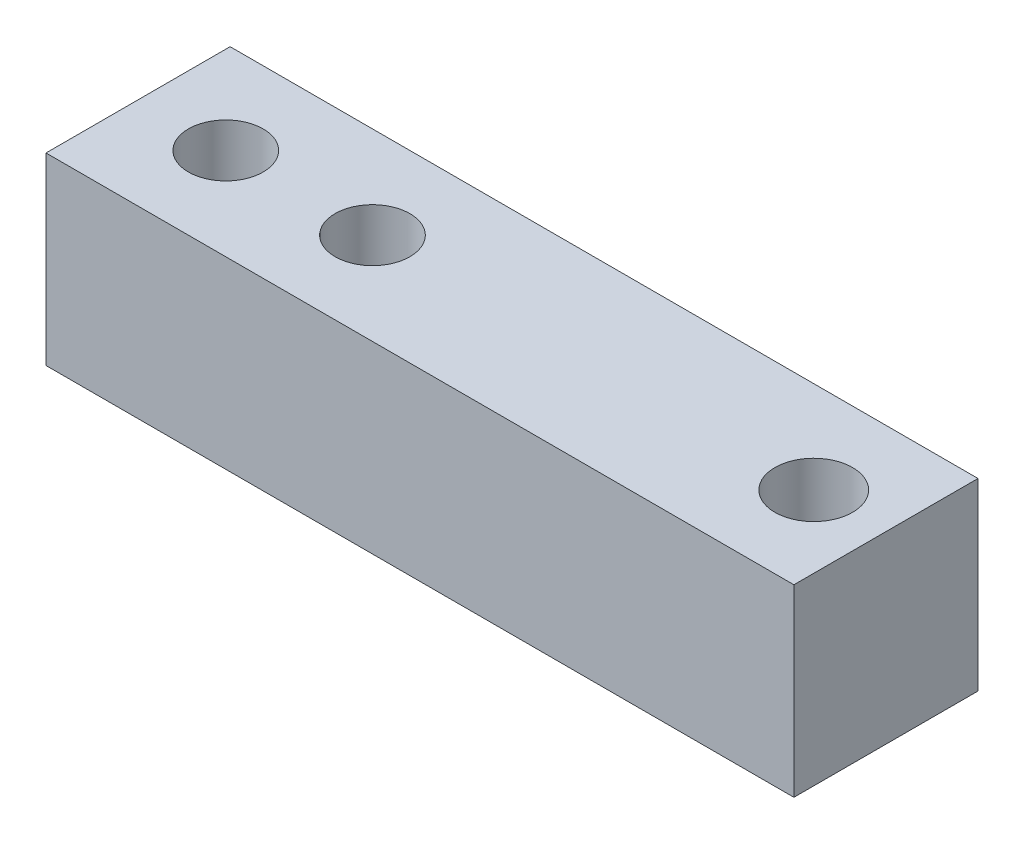
ISO-10303-21;
HEADER;
FILE_DESCRIPTION(('STEP AP214'),'2;1');
FILE_NAME('part.step','',(''),(''),'','','');
FILE_SCHEMA(('AUTOMOTIVE_DESIGN { 1 0 10303 214 1 1 1 1 }'));
ENDSEC;
DATA;
#1=APPLICATION_CONTEXT('core data for automotive mechanical design processes');
#2=APPLICATION_PROTOCOL_DEFINITION('international standard','automotive_design',2000,#1);
#3=PRODUCT_CONTEXT('',#1,'mechanical');
#4=PRODUCT('Part','Part','',(#3));
#5=PRODUCT_RELATED_PRODUCT_CATEGORY('part','',(#4));
#6=PRODUCT_DEFINITION_FORMATION('','',#4);
#7=PRODUCT_DEFINITION_CONTEXT('part definition',#1,'design');
#8=PRODUCT_DEFINITION('design','',#6,#7);
#9=PRODUCT_DEFINITION_SHAPE('','',#8);
#10=(LENGTH_UNIT() NAMED_UNIT(*) SI_UNIT(.MILLI.,.METRE.));
#11=(NAMED_UNIT(*) PLANE_ANGLE_UNIT() SI_UNIT($,.RADIAN.));
#12=(NAMED_UNIT(*) SI_UNIT($,.STERADIAN.) SOLID_ANGLE_UNIT());
#13=UNCERTAINTY_MEASURE_WITH_UNIT(LENGTH_MEASURE(1.E-05),#10,'distance_accuracy_value','');
#14=(GEOMETRIC_REPRESENTATION_CONTEXT(3) GLOBAL_UNCERTAINTY_ASSIGNED_CONTEXT((#13)) GLOBAL_UNIT_ASSIGNED_CONTEXT((#10,
#11,#12)) REPRESENTATION_CONTEXT('',''));
#15=CARTESIAN_POINT('',(0.,0.,0.));
#16=DIRECTION('',(0.,0.,1.));
#17=DIRECTION('',(1.,0.,0.));
#18=AXIS2_PLACEMENT_3D('',#15,#16,#17);
#19=CARTESIAN_POINT('',(65.,32.,-16.));
#20=DIRECTION('',(-1.,0.,0.));
#21=DIRECTION('',(0.,0.,1.));
#22=AXIS2_PLACEMENT_3D('',#19,#20,#21);
#23=PLANE('',#22);
#24=DIRECTION('',(0.,0.,-1.));
#25=VECTOR('',#24,1.);
#26=CARTESIAN_POINT('',(65.,0.,-16.));
#27=LINE('',#26,#25);
#28=CARTESIAN_POINT('',(65.,0.,16.));
#29=VERTEX_POINT('',#28);
#30=CARTESIAN_POINT('',(65.,0.,-16.));
#31=VERTEX_POINT('',#30);
#32=EDGE_CURVE('E107',#29,#31,#27,.T.);
#33=ORIENTED_EDGE('',*,*,#32,.T.);
#34=DIRECTION('',(0.,-1.,0.));
#35=VECTOR('',#34,1.);
#36=CARTESIAN_POINT('',(65.,32.,-16.));
#37=LINE('',#36,#35);
#38=CARTESIAN_POINT('',(65.,32.,-16.));
#39=VERTEX_POINT('',#38);
#40=EDGE_CURVE('E11',#39,#31,#37,.T.);
#41=ORIENTED_EDGE('',*,*,#40,.F.);
#42=DIRECTION('',(0.,0.,-1.));
#43=VECTOR('',#42,1.);
#44=CARTESIAN_POINT('',(65.,32.,-16.));
#45=LINE('',#44,#43);
#46=CARTESIAN_POINT('',(65.,32.,16.));
#47=VERTEX_POINT('',#46);
#48=EDGE_CURVE('E91',#47,#39,#45,.T.);
#49=ORIENTED_EDGE('',*,*,#48,.F.);
#50=DIRECTION('',(0.,-1.,0.));
#51=VECTOR('',#50,1.);
#52=CARTESIAN_POINT('',(65.,32.,16.));
#53=LINE('',#52,#51);
#54=EDGE_CURVE('E103',#47,#29,#53,.T.);
#55=ORIENTED_EDGE('',*,*,#54,.T.);
#56=EDGE_LOOP('',(#33,#41,#49,#55));
#57=FACE_BOUND('',#56,.T.);
#58=ADVANCED_FACE('F39',(#57),#23,.F.);
#59=CARTESIAN_POINT('',(-65.,32.,-16.));
#60=DIRECTION('',(0.,0.,1.));
#61=DIRECTION('',(1.,0.,0.));
#62=AXIS2_PLACEMENT_3D('',#59,#60,#61);
#63=PLANE('',#62);
#64=DIRECTION('',(-1.,0.,0.));
#65=VECTOR('',#64,1.);
#66=CARTESIAN_POINT('',(-65.,0.,-16.));
#67=LINE('',#66,#65);
#68=CARTESIAN_POINT('',(-65.,0.,-16.));
#69=VERTEX_POINT('',#68);
#70=EDGE_CURVE('E96',#31,#69,#67,.T.);
#71=ORIENTED_EDGE('',*,*,#70,.T.);
#72=DIRECTION('',(0.,-1.,0.));
#73=VECTOR('',#72,1.);
#74=CARTESIAN_POINT('',(-65.,32.,-16.));
#75=LINE('',#74,#73);
#76=CARTESIAN_POINT('',(-65.,32.,-16.));
#77=VERTEX_POINT('',#76);
#78=EDGE_CURVE('E48',#77,#69,#75,.T.);
#79=ORIENTED_EDGE('',*,*,#78,.F.);
#80=DIRECTION('',(-1.,0.,0.));
#81=VECTOR('',#80,1.);
#82=CARTESIAN_POINT('',(-65.,32.,-16.));
#83=LINE('',#82,#81);
#84=EDGE_CURVE('E86',#39,#77,#83,.T.);
#85=ORIENTED_EDGE('',*,*,#84,.F.);
#86=ORIENTED_EDGE('',*,*,#40,.T.);
#87=EDGE_LOOP('',(#71,#79,#85,#86));
#88=FACE_BOUND('',#87,.T.);
#89=ADVANCED_FACE('F95',(#88),#63,.F.);
#90=CARTESIAN_POINT('',(-65.,32.,-16.));
#91=DIRECTION('',(1.,0.,0.));
#92=DIRECTION('',(0.,0.,-1.));
#93=AXIS2_PLACEMENT_3D('',#90,#91,#92);
#94=PLANE('',#93);
#95=DIRECTION('',(0.,0.,1.));
#96=VECTOR('',#95,1.);
#97=CARTESIAN_POINT('',(-65.,0.,-16.));
#98=LINE('',#97,#96);
#99=CARTESIAN_POINT('',(-65.,0.,16.));
#100=VERTEX_POINT('',#99);
#101=EDGE_CURVE('E73',#69,#100,#98,.T.);
#102=ORIENTED_EDGE('',*,*,#101,.T.);
#103=DIRECTION('',(0.,-1.,0.));
#104=VECTOR('',#103,1.);
#105=CARTESIAN_POINT('',(-65.,32.,16.));
#106=LINE('',#105,#104);
#107=CARTESIAN_POINT('',(-65.,32.,16.));
#108=VERTEX_POINT('',#107);
#109=EDGE_CURVE('E98',#108,#100,#106,.T.);
#110=ORIENTED_EDGE('',*,*,#109,.F.);
#111=DIRECTION('',(0.,0.,1.));
#112=VECTOR('',#111,1.);
#113=CARTESIAN_POINT('',(-65.,32.,-16.));
#114=LINE('',#113,#112);
#115=EDGE_CURVE('E89',#77,#108,#114,.T.);
#116=ORIENTED_EDGE('',*,*,#115,.F.);
#117=ORIENTED_EDGE('',*,*,#78,.T.);
#118=EDGE_LOOP('',(#102,#110,#116,#117));
#119=FACE_BOUND('',#118,.T.);
#120=ADVANCED_FACE('F99',(#119),#94,.F.);
#121=CARTESIAN_POINT('',(-65.,32.,16.));
#122=DIRECTION('',(0.,0.,-1.));
#123=DIRECTION('',(-1.,0.,0.));
#124=AXIS2_PLACEMENT_3D('',#121,#122,#123);
#125=PLANE('',#124);
#126=DIRECTION('',(1.,0.,0.));
#127=VECTOR('',#126,1.);
#128=CARTESIAN_POINT('',(-65.,0.,16.));
#129=LINE('',#128,#127);
#130=EDGE_CURVE('E79',#100,#29,#129,.T.);
#131=ORIENTED_EDGE('',*,*,#130,.T.);
#132=ORIENTED_EDGE('',*,*,#54,.F.);
#133=DIRECTION('',(1.,0.,0.));
#134=VECTOR('',#133,1.);
#135=CARTESIAN_POINT('',(-65.,32.,16.));
#136=LINE('',#135,#134);
#137=EDGE_CURVE('E56',#108,#47,#136,.T.);
#138=ORIENTED_EDGE('',*,*,#137,.F.);
#139=ORIENTED_EDGE('',*,*,#109,.T.);
#140=EDGE_LOOP('',(#131,#132,#138,#139));
#141=FACE_BOUND('',#140,.T.);
#142=ADVANCED_FACE('F121',(#141),#125,.F.);
#143=CARTESIAN_POINT('',(0.,32.,0.));
#144=DIRECTION('',(0.,1.,0.));
#145=DIRECTION('',(0.,0.,1.));
#146=AXIS2_PLACEMENT_3D('',#143,#144,#145);
#147=PLANE('',#146);
#148=CARTESIAN_POINT('',(-49.75,32.,0.));
#149=DIRECTION('',(0.,1.,0.));
#150=DIRECTION('',(0.,0.,1.));
#151=AXIS2_PLACEMENT_3D('',#148,#149,#150);
#152=CIRCLE('',#151,6.5);
#153=CARTESIAN_POINT('',(-49.75,32.,6.5));
#154=VERTEX_POINT('',#153);
#155=EDGE_CURVE('E144',#154,#154,#152,.T.);
#156=ORIENTED_EDGE('',*,*,#155,.F.);
#157=EDGE_LOOP('',(#156));
#158=FACE_BOUND('',#157,.T.);
#159=CARTESIAN_POINT('',(-24.25,32.,0.));
#160=DIRECTION('',(0.,1.,0.));
#161=DIRECTION('',(0.,0.,1.));
#162=AXIS2_PLACEMENT_3D('',#159,#160,#161);
#163=CIRCLE('',#162,6.50000000000001);
#164=CARTESIAN_POINT('',(-24.25,32.,6.50000000000001));
#165=VERTEX_POINT('',#164);
#166=EDGE_CURVE('E136',#165,#165,#163,.T.);
#167=ORIENTED_EDGE('',*,*,#166,.F.);
#168=EDGE_LOOP('',(#167));
#169=FACE_BOUND('',#168,.T.);
#170=CARTESIAN_POINT('',(52.45,32.,0.));
#171=DIRECTION('',(0.,1.,0.));
#172=DIRECTION('',(0.,0.,1.));
#173=AXIS2_PLACEMENT_3D('',#170,#171,#172);
#174=CIRCLE('',#173,6.75);
#175=CARTESIAN_POINT('',(52.45,32.,6.75));
#176=VERTEX_POINT('',#175);
#177=EDGE_CURVE('E128',#176,#176,#174,.T.);
#178=ORIENTED_EDGE('',*,*,#177,.F.);
#179=EDGE_LOOP('',(#178));
#180=FACE_BOUND('',#179,.T.);
#181=ORIENTED_EDGE('',*,*,#48,.T.);
#182=ORIENTED_EDGE('',*,*,#84,.T.);
#183=ORIENTED_EDGE('',*,*,#115,.T.);
#184=ORIENTED_EDGE('',*,*,#137,.T.);
#185=EDGE_LOOP('',(#181,#182,#183,#184));
#186=FACE_BOUND('',#185,.T.);
#187=ADVANCED_FACE('F87',(#158,#169,#180,#186),#147,.T.);
#188=CARTESIAN_POINT('',(0.,0.,0.));
#189=DIRECTION('',(0.,1.,0.));
#190=DIRECTION('',(0.,0.,1.));
#191=AXIS2_PLACEMENT_3D('',#188,#189,#190);
#192=PLANE('',#191);
#193=CARTESIAN_POINT('',(-49.75,0.,0.));
#194=DIRECTION('',(0.,1.,0.));
#195=DIRECTION('',(0.,0.,1.));
#196=AXIS2_PLACEMENT_3D('',#193,#194,#195);
#197=CIRCLE('',#196,6.5);
#198=CARTESIAN_POINT('',(-49.75,0.,6.5));
#199=VERTEX_POINT('',#198);
#200=EDGE_CURVE('E111',#199,#199,#197,.T.);
#201=ORIENTED_EDGE('',*,*,#200,.T.);
#202=EDGE_LOOP('',(#201));
#203=FACE_BOUND('',#202,.T.);
#204=CARTESIAN_POINT('',(-24.25,0.,0.));
#205=DIRECTION('',(0.,1.,0.));
#206=DIRECTION('',(0.,0.,1.));
#207=AXIS2_PLACEMENT_3D('',#204,#205,#206);
#208=CIRCLE('',#207,6.50000000000001);
#209=CARTESIAN_POINT('',(-24.25,0.,6.50000000000001));
#210=VERTEX_POINT('',#209);
#211=EDGE_CURVE('E140',#210,#210,#208,.T.);
#212=ORIENTED_EDGE('',*,*,#211,.T.);
#213=EDGE_LOOP('',(#212));
#214=FACE_BOUND('',#213,.T.);
#215=CARTESIAN_POINT('',(52.45,0.,0.));
#216=DIRECTION('',(0.,1.,0.));
#217=DIRECTION('',(0.,0.,1.));
#218=AXIS2_PLACEMENT_3D('',#215,#216,#217);
#219=CIRCLE('',#218,6.75);
#220=CARTESIAN_POINT('',(52.45,0.,6.75));
#221=VERTEX_POINT('',#220);
#222=EDGE_CURVE('E132',#221,#221,#219,.T.);
#223=ORIENTED_EDGE('',*,*,#222,.T.);
#224=EDGE_LOOP('',(#223));
#225=FACE_BOUND('',#224,.T.);
#226=ORIENTED_EDGE('',*,*,#32,.F.);
#227=ORIENTED_EDGE('',*,*,#130,.F.);
#228=ORIENTED_EDGE('',*,*,#101,.F.);
#229=ORIENTED_EDGE('',*,*,#70,.F.);
#230=EDGE_LOOP('',(#226,#227,#228,#229));
#231=FACE_BOUND('',#230,.T.);
#232=ADVANCED_FACE('F124',(#203,#214,#225,#231),#192,.F.);
#233=CARTESIAN_POINT('',(52.45,0.,0.));
#234=DIRECTION('',(0.,1.,0.));
#235=DIRECTION('',(0.,0.,1.));
#236=AXIS2_PLACEMENT_3D('',#233,#234,#235);
#237=CYLINDRICAL_SURFACE('',#236,6.75);
#238=ORIENTED_EDGE('',*,*,#222,.F.);
#239=EDGE_LOOP('',(#238));
#240=FACE_BOUND('',#239,.T.);
#241=ORIENTED_EDGE('',*,*,#177,.T.);
#242=EDGE_LOOP('',(#241));
#243=FACE_BOUND('',#242,.T.);
#244=ADVANCED_FACE('F168',(#240,#243),#237,.F.);
#245=CARTESIAN_POINT('',(-24.25,0.,0.));
#246=DIRECTION('',(0.,1.,0.));
#247=DIRECTION('',(0.,0.,1.));
#248=AXIS2_PLACEMENT_3D('',#245,#246,#247);
#249=CYLINDRICAL_SURFACE('',#248,6.50000000000001);
#250=ORIENTED_EDGE('',*,*,#211,.F.);
#251=EDGE_LOOP('',(#250));
#252=FACE_BOUND('',#251,.T.);
#253=ORIENTED_EDGE('',*,*,#166,.T.);
#254=EDGE_LOOP('',(#253));
#255=FACE_BOUND('',#254,.T.);
#256=ADVANCED_FACE('F157',(#252,#255),#249,.F.);
#257=CARTESIAN_POINT('',(-49.75,0.,0.));
#258=DIRECTION('',(0.,1.,0.));
#259=DIRECTION('',(0.,0.,1.));
#260=AXIS2_PLACEMENT_3D('',#257,#258,#259);
#261=CYLINDRICAL_SURFACE('',#260,6.5);
#262=ORIENTED_EDGE('',*,*,#200,.F.);
#263=EDGE_LOOP('',(#262));
#264=FACE_BOUND('',#263,.T.);
#265=ORIENTED_EDGE('',*,*,#155,.T.);
#266=EDGE_LOOP('',(#265));
#267=FACE_BOUND('',#266,.T.);
#268=ADVANCED_FACE('F154',(#264,#267),#261,.F.);
#269=CLOSED_SHELL('',(#58,#89,#120,#142,#187,#232,#244,#256,#268));
#270=MANIFOLD_SOLID_BREP('B2',#269);
#271=ADVANCED_BREP_SHAPE_REPRESENTATION('',(#18,#270),#14);
#272=SHAPE_DEFINITION_REPRESENTATION(#9,#271);
ENDSEC;
END-ISO-10303-21;
